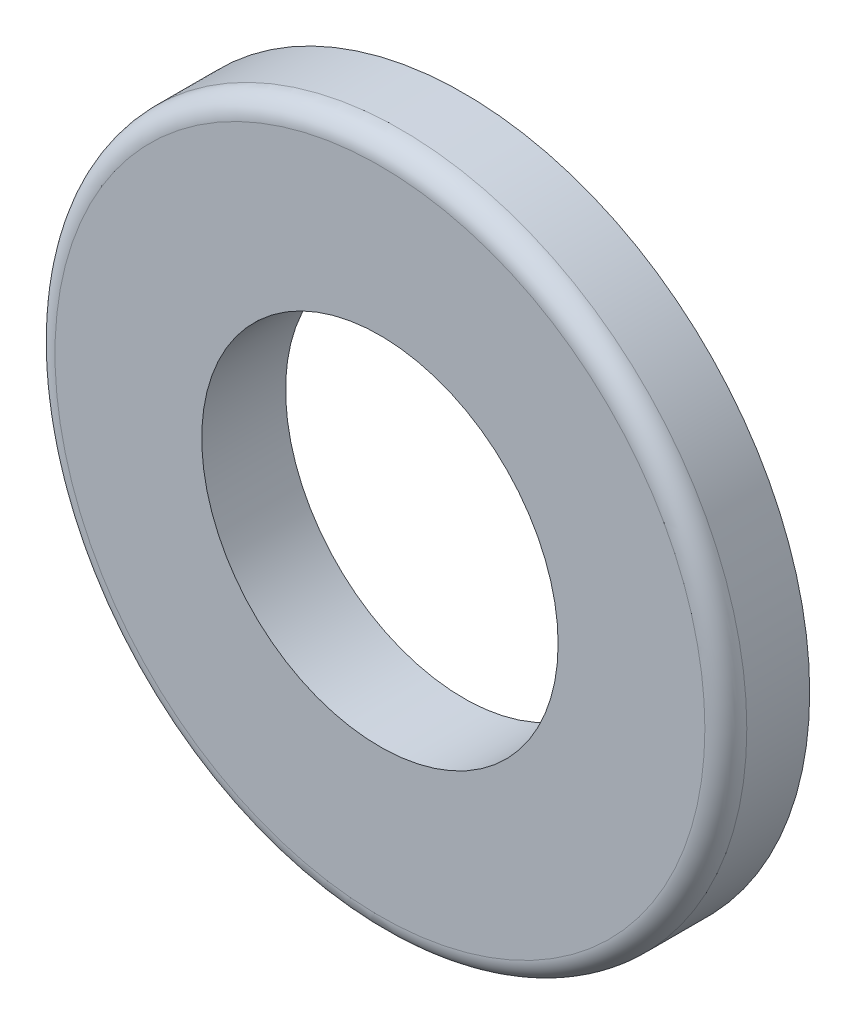
ISO-10303-21;
HEADER;
FILE_DESCRIPTION(('STEP AP214'),'2;1');
FILE_NAME('part.step','',(''),(''),'','','');
FILE_SCHEMA(('AUTOMOTIVE_DESIGN { 1 0 10303 214 1 1 1 1 }'));
ENDSEC;
DATA;
#1=APPLICATION_CONTEXT('core data for automotive mechanical design processes');
#2=APPLICATION_PROTOCOL_DEFINITION('international standard','automotive_design',2000,#1);
#3=PRODUCT_CONTEXT('',#1,'mechanical');
#4=PRODUCT('Part','Part','',(#3));
#5=PRODUCT_RELATED_PRODUCT_CATEGORY('part','',(#4));
#6=PRODUCT_DEFINITION_FORMATION('','',#4);
#7=PRODUCT_DEFINITION_CONTEXT('part definition',#1,'design');
#8=PRODUCT_DEFINITION('design','',#6,#7);
#9=PRODUCT_DEFINITION_SHAPE('','',#8);
#10=(LENGTH_UNIT() NAMED_UNIT(*) SI_UNIT(.MILLI.,.METRE.));
#11=(NAMED_UNIT(*) PLANE_ANGLE_UNIT() SI_UNIT($,.RADIAN.));
#12=(NAMED_UNIT(*) SI_UNIT($,.STERADIAN.) SOLID_ANGLE_UNIT());
#13=UNCERTAINTY_MEASURE_WITH_UNIT(LENGTH_MEASURE(1.E-05),#10,'distance_accuracy_value','');
#14=(GEOMETRIC_REPRESENTATION_CONTEXT(3) GLOBAL_UNCERTAINTY_ASSIGNED_CONTEXT((#13)) GLOBAL_UNIT_ASSIGNED_CONTEXT((#10,
#11,#12)) REPRESENTATION_CONTEXT('',''));
#15=CARTESIAN_POINT('',(0.,0.,0.));
#16=DIRECTION('',(0.,0.,1.));
#17=DIRECTION('',(1.,0.,0.));
#18=AXIS2_PLACEMENT_3D('',#15,#16,#17);
#19=CARTESIAN_POINT('',(0.,0.,2.));
#20=DIRECTION('',(0.,0.,1.));
#21=DIRECTION('',(1.,0.,0.));
#22=AXIS2_PLACEMENT_3D('',#19,#20,#21);
#23=PLANE('',#22);
#24=CARTESIAN_POINT('',(0.,0.,2.));
#25=DIRECTION('',(0.,0.,1.));
#26=DIRECTION('',(1.,0.,0.));
#27=AXIS2_PLACEMENT_3D('',#24,#25,#26);
#28=CIRCLE('',#27,7.75);
#29=CARTESIAN_POINT('',(7.75,0.,2.));
#30=VERTEX_POINT('',#29);
#31=EDGE_CURVE('E39',#30,#30,#28,.T.);
#32=ORIENTED_EDGE('',*,*,#31,.T.);
#33=EDGE_LOOP('',(#32));
#34=FACE_BOUND('',#33,.T.);
#35=CARTESIAN_POINT('',(0.,0.,2.));
#36=DIRECTION('',(0.,0.,1.));
#37=DIRECTION('',(1.,0.,0.));
#38=AXIS2_PLACEMENT_3D('',#35,#36,#37);
#39=CIRCLE('',#38,4.25);
#40=CARTESIAN_POINT('',(4.25,0.,2.));
#41=VERTEX_POINT('',#40);
#42=EDGE_CURVE('E47',#41,#41,#39,.T.);
#43=ORIENTED_EDGE('',*,*,#42,.F.);
#44=EDGE_LOOP('',(#43));
#45=FACE_BOUND('',#44,.T.);
#46=ADVANCED_FACE('F32',(#34,#45),#23,.T.);
#47=CARTESIAN_POINT('',(0.,0.,0.));
#48=DIRECTION('',(0.,0.,1.));
#49=DIRECTION('',(1.,0.,0.));
#50=AXIS2_PLACEMENT_3D('',#47,#48,#49);
#51=PLANE('',#50);
#52=CARTESIAN_POINT('',(0.,0.,0.));
#53=DIRECTION('',(0.,0.,1.));
#54=DIRECTION('',(1.,0.,0.));
#55=AXIS2_PLACEMENT_3D('',#52,#53,#54);
#56=CIRCLE('',#55,8.25);
#57=CARTESIAN_POINT('',(8.25,0.,0.));
#58=VERTEX_POINT('',#57);
#59=EDGE_CURVE('E43',#58,#58,#56,.T.);
#60=ORIENTED_EDGE('',*,*,#59,.F.);
#61=EDGE_LOOP('',(#60));
#62=FACE_BOUND('',#61,.T.);
#63=CARTESIAN_POINT('',(0.,0.,0.));
#64=DIRECTION('',(0.,0.,1.));
#65=DIRECTION('',(1.,0.,0.));
#66=AXIS2_PLACEMENT_3D('',#63,#64,#65);
#67=CIRCLE('',#66,4.25);
#68=CARTESIAN_POINT('',(4.25,0.,0.));
#69=VERTEX_POINT('',#68);
#70=EDGE_CURVE('E50',#69,#69,#67,.T.);
#71=ORIENTED_EDGE('',*,*,#70,.T.);
#72=EDGE_LOOP('',(#71));
#73=FACE_BOUND('',#72,.T.);
#74=ADVANCED_FACE('F60',(#62,#73),#51,.F.);
#75=CARTESIAN_POINT('',(0.,0.,2.));
#76=DIRECTION('',(0.,0.,-1.));
#77=DIRECTION('',(-1.,0.,0.));
#78=AXIS2_PLACEMENT_3D('',#75,#76,#77);
#79=CYLINDRICAL_SURFACE('',#78,8.25);
#80=CARTESIAN_POINT('',(0.,0.,1.5));
#81=DIRECTION('',(0.,0.,1.));
#82=DIRECTION('',(1.,0.,0.));
#83=AXIS2_PLACEMENT_3D('',#80,#81,#82);
#84=CIRCLE('',#83,8.25);
#85=CARTESIAN_POINT('',(8.25,0.,1.5));
#86=VERTEX_POINT('',#85);
#87=EDGE_CURVE('E10',#86,#86,#84,.F.);
#88=ORIENTED_EDGE('',*,*,#87,.T.);
#89=EDGE_LOOP('',(#88));
#90=FACE_BOUND('',#89,.T.);
#91=ORIENTED_EDGE('',*,*,#59,.T.);
#92=EDGE_LOOP('',(#91));
#93=FACE_BOUND('',#92,.T.);
#94=ADVANCED_FACE('F65',(#90,#93),#79,.T.);
#95=CARTESIAN_POINT('',(0.,0.,2.));
#96=DIRECTION('',(0.,0.,-1.));
#97=DIRECTION('',(-1.,0.,0.));
#98=AXIS2_PLACEMENT_3D('',#95,#96,#97);
#99=CYLINDRICAL_SURFACE('',#98,4.25);
#100=ORIENTED_EDGE('',*,*,#42,.T.);
#101=EDGE_LOOP('',(#100));
#102=FACE_BOUND('',#101,.T.);
#103=ORIENTED_EDGE('',*,*,#70,.F.);
#104=EDGE_LOOP('',(#103));
#105=FACE_BOUND('',#104,.T.);
#106=ADVANCED_FACE('F56',(#102,#105),#99,.F.);
#107=CARTESIAN_POINT('',(0.,0.,1.5));
#108=DIRECTION('',(0.,0.,1.));
#109=DIRECTION('',(1.,0.,0.));
#110=AXIS2_PLACEMENT_3D('',#107,#108,#109);
#111=TOROIDAL_SURFACE('',#110,7.75,0.5);
#112=ORIENTED_EDGE('',*,*,#87,.F.);
#113=EDGE_LOOP('',(#112));
#114=FACE_BOUND('',#113,.T.);
#115=ORIENTED_EDGE('',*,*,#31,.F.);
#116=EDGE_LOOP('',(#115));
#117=FACE_BOUND('',#116,.T.);
#118=ADVANCED_FACE('F34',(#114,#117),#111,.T.);
#119=CLOSED_SHELL('',(#46,#74,#94,#106,#118));
#120=MANIFOLD_SOLID_BREP('B2',#119);
#121=ADVANCED_BREP_SHAPE_REPRESENTATION('',(#18,#120),#14);
#122=SHAPE_DEFINITION_REPRESENTATION(#9,#121);
ENDSEC;
END-ISO-10303-21;
